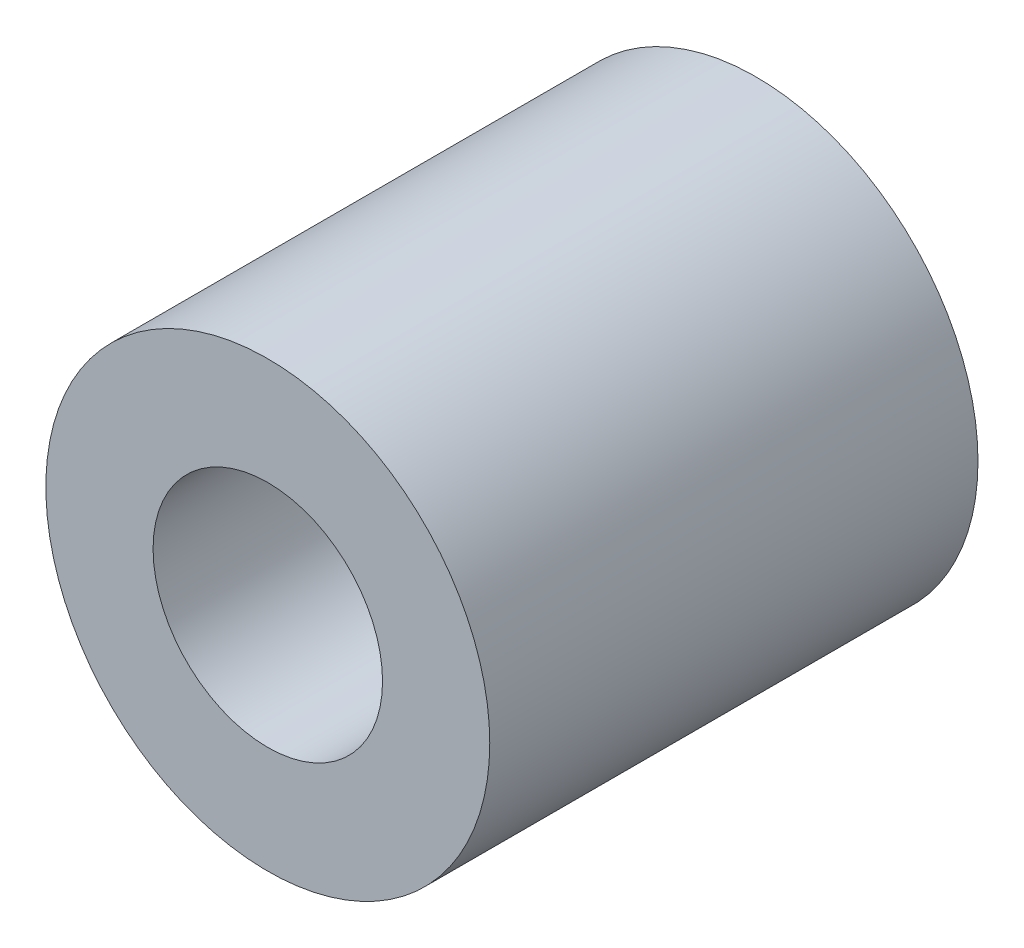
ISO-10303-21;
HEADER;
FILE_DESCRIPTION(('STEP AP214'),'2;1');
FILE_NAME('part.step','',(''),(''),'','','');
FILE_SCHEMA(('AUTOMOTIVE_DESIGN { 1 0 10303 214 1 1 1 1 }'));
ENDSEC;
DATA;
#1=APPLICATION_CONTEXT('core data for automotive mechanical design processes');
#2=APPLICATION_PROTOCOL_DEFINITION('international standard','automotive_design',2000,#1);
#3=PRODUCT_CONTEXT('',#1,'mechanical');
#4=PRODUCT('Part','Part','',(#3));
#5=PRODUCT_RELATED_PRODUCT_CATEGORY('part','',(#4));
#6=PRODUCT_DEFINITION_FORMATION('','',#4);
#7=PRODUCT_DEFINITION_CONTEXT('part definition',#1,'design');
#8=PRODUCT_DEFINITION('design','',#6,#7);
#9=PRODUCT_DEFINITION_SHAPE('','',#8);
#10=(LENGTH_UNIT() NAMED_UNIT(*) SI_UNIT(.MILLI.,.METRE.));
#11=(NAMED_UNIT(*) PLANE_ANGLE_UNIT() SI_UNIT($,.RADIAN.));
#12=(NAMED_UNIT(*) SI_UNIT($,.STERADIAN.) SOLID_ANGLE_UNIT());
#13=UNCERTAINTY_MEASURE_WITH_UNIT(LENGTH_MEASURE(1.E-05),#10,'distance_accuracy_value','');
#14=(GEOMETRIC_REPRESENTATION_CONTEXT(3) GLOBAL_UNCERTAINTY_ASSIGNED_CONTEXT((#13)) GLOBAL_UNIT_ASSIGNED_CONTEXT((#10,
#11,#12)) REPRESENTATION_CONTEXT('',''));
#15=CARTESIAN_POINT('',(0.,0.,0.));
#16=DIRECTION('',(0.,0.,1.));
#17=DIRECTION('',(1.,0.,0.));
#18=AXIS2_PLACEMENT_3D('',#15,#16,#17);
#19=CARTESIAN_POINT('',(0.,0.,40.));
#20=DIRECTION('',(0.,0.,1.));
#21=DIRECTION('',(1.,0.,0.));
#22=AXIS2_PLACEMENT_3D('',#19,#20,#21);
#23=PLANE('',#22);
#24=CARTESIAN_POINT('',(0.,0.,40.));
#25=DIRECTION('',(0.,0.,1.));
#26=DIRECTION('',(1.,0.,0.));
#27=AXIS2_PLACEMENT_3D('',#24,#25,#26);
#28=CIRCLE('',#27,18.185);
#29=CARTESIAN_POINT('',(18.185,0.,40.));
#30=VERTEX_POINT('',#29);
#31=EDGE_CURVE('E10',#30,#30,#28,.T.);
#32=ORIENTED_EDGE('',*,*,#31,.T.);
#33=EDGE_LOOP('',(#32));
#34=FACE_BOUND('',#33,.T.);
#35=CARTESIAN_POINT('',(0.,0.,40.));
#36=DIRECTION('',(0.,0.,1.));
#37=DIRECTION('',(1.,0.,0.));
#38=AXIS2_PLACEMENT_3D('',#35,#36,#37);
#39=CIRCLE('',#38,9.4);
#40=CARTESIAN_POINT('',(9.4,0.,40.));
#41=VERTEX_POINT('',#40);
#42=EDGE_CURVE('E41',#41,#41,#39,.T.);
#43=ORIENTED_EDGE('',*,*,#42,.F.);
#44=EDGE_LOOP('',(#43));
#45=FACE_BOUND('',#44,.T.);
#46=ADVANCED_FACE('F30',(#34,#45),#23,.T.);
#47=CARTESIAN_POINT('',(0.,0.,0.));
#48=DIRECTION('',(0.,0.,1.));
#49=DIRECTION('',(1.,0.,0.));
#50=AXIS2_PLACEMENT_3D('',#47,#48,#49);
#51=PLANE('',#50);
#52=CARTESIAN_POINT('',(0.,0.,0.));
#53=DIRECTION('',(0.,0.,1.));
#54=DIRECTION('',(1.,0.,0.));
#55=AXIS2_PLACEMENT_3D('',#52,#53,#54);
#56=CIRCLE('',#55,18.185);
#57=CARTESIAN_POINT('',(18.185,0.,0.));
#58=VERTEX_POINT('',#57);
#59=EDGE_CURVE('E34',#58,#58,#56,.T.);
#60=ORIENTED_EDGE('',*,*,#59,.F.);
#61=EDGE_LOOP('',(#60));
#62=FACE_BOUND('',#61,.T.);
#63=CARTESIAN_POINT('',(0.,0.,0.));
#64=DIRECTION('',(0.,0.,1.));
#65=DIRECTION('',(1.,0.,0.));
#66=AXIS2_PLACEMENT_3D('',#63,#64,#65);
#67=CIRCLE('',#66,9.4);
#68=CARTESIAN_POINT('',(9.4,0.,0.));
#69=VERTEX_POINT('',#68);
#70=EDGE_CURVE('E43',#69,#69,#67,.T.);
#71=ORIENTED_EDGE('',*,*,#70,.T.);
#72=EDGE_LOOP('',(#71));
#73=FACE_BOUND('',#72,.T.);
#74=ADVANCED_FACE('F53',(#62,#73),#51,.F.);
#75=CARTESIAN_POINT('',(0.,0.,40.));
#76=DIRECTION('',(0.,0.,-1.));
#77=DIRECTION('',(-1.,0.,0.));
#78=AXIS2_PLACEMENT_3D('',#75,#76,#77);
#79=CYLINDRICAL_SURFACE('',#78,18.185);
#80=ORIENTED_EDGE('',*,*,#31,.F.);
#81=EDGE_LOOP('',(#80));
#82=FACE_BOUND('',#81,.T.);
#83=ORIENTED_EDGE('',*,*,#59,.T.);
#84=EDGE_LOOP('',(#83));
#85=FACE_BOUND('',#84,.T.);
#86=ADVANCED_FACE('F32',(#82,#85),#79,.T.);
#87=CARTESIAN_POINT('',(0.,0.,40.));
#88=DIRECTION('',(0.,0.,-1.));
#89=DIRECTION('',(-1.,0.,0.));
#90=AXIS2_PLACEMENT_3D('',#87,#88,#89);
#91=CYLINDRICAL_SURFACE('',#90,9.4);
#92=ORIENTED_EDGE('',*,*,#42,.T.);
#93=EDGE_LOOP('',(#92));
#94=FACE_BOUND('',#93,.T.);
#95=ORIENTED_EDGE('',*,*,#70,.F.);
#96=EDGE_LOOP('',(#95));
#97=FACE_BOUND('',#96,.T.);
#98=ADVANCED_FACE('F49',(#94,#97),#91,.F.);
#99=CLOSED_SHELL('',(#46,#74,#86,#98));
#100=MANIFOLD_SOLID_BREP('B2',#99);
#101=ADVANCED_BREP_SHAPE_REPRESENTATION('',(#18,#100),#14);
#102=SHAPE_DEFINITION_REPRESENTATION(#9,#101);
ENDSEC;
END-ISO-10303-21;
